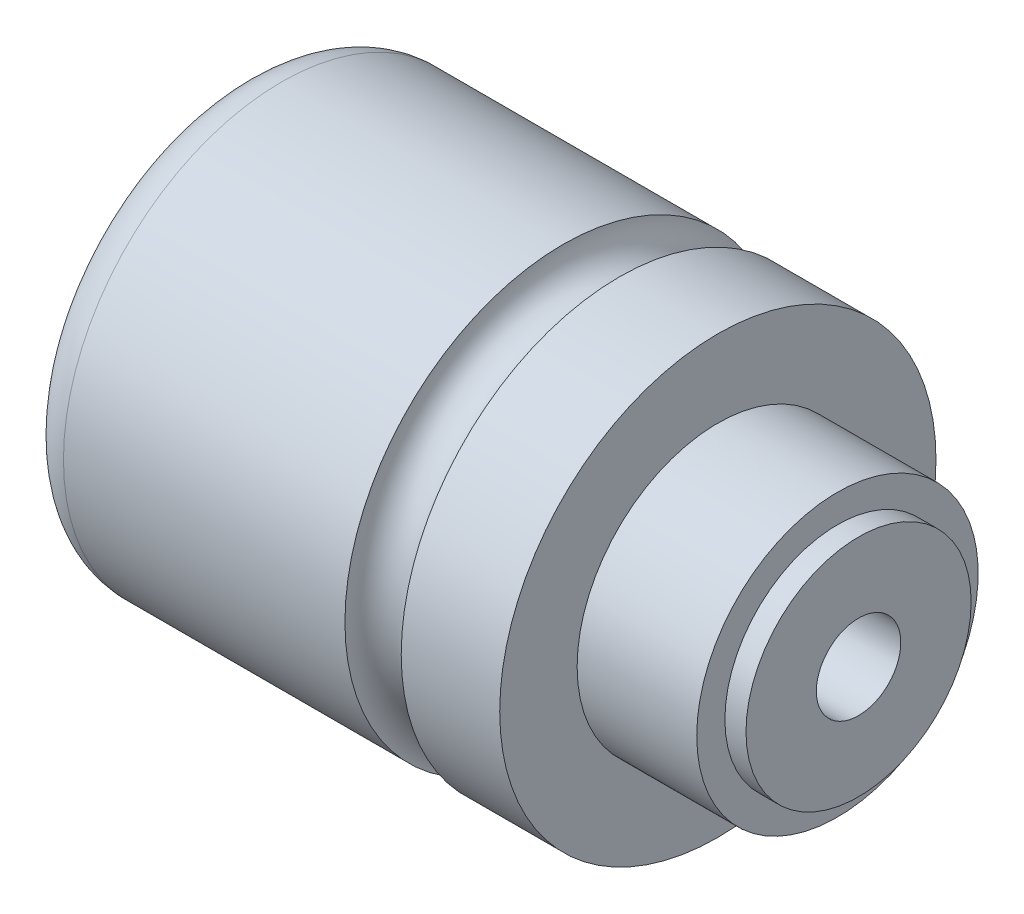
ISO-10303-21;
HEADER;
FILE_DESCRIPTION(('STEP AP214'),'2;1');
FILE_NAME('part.step','',(''),(''),'','','');
FILE_SCHEMA(('AUTOMOTIVE_DESIGN { 1 0 10303 214 1 1 1 1 }'));
ENDSEC;
DATA;
#1=APPLICATION_CONTEXT('core data for automotive mechanical design processes');
#2=APPLICATION_PROTOCOL_DEFINITION('international standard','automotive_design',2000,#1);
#3=PRODUCT_CONTEXT('',#1,'mechanical');
#4=PRODUCT('Part','Part','',(#3));
#5=PRODUCT_RELATED_PRODUCT_CATEGORY('part','',(#4));
#6=PRODUCT_DEFINITION_FORMATION('','',#4);
#7=PRODUCT_DEFINITION_CONTEXT('part definition',#1,'design');
#8=PRODUCT_DEFINITION('design','',#6,#7);
#9=PRODUCT_DEFINITION_SHAPE('','',#8);
#10=(LENGTH_UNIT() NAMED_UNIT(*) SI_UNIT(.MILLI.,.METRE.));
#11=(NAMED_UNIT(*) PLANE_ANGLE_UNIT() SI_UNIT($,.RADIAN.));
#12=(NAMED_UNIT(*) SI_UNIT($,.STERADIAN.) SOLID_ANGLE_UNIT());
#13=UNCERTAINTY_MEASURE_WITH_UNIT(LENGTH_MEASURE(1.E-05),#10,'distance_accuracy_value','');
#14=(GEOMETRIC_REPRESENTATION_CONTEXT(3) GLOBAL_UNCERTAINTY_ASSIGNED_CONTEXT((#13)) GLOBAL_UNIT_ASSIGNED_CONTEXT((#10,
#11,#12)) REPRESENTATION_CONTEXT('',''));
#15=CARTESIAN_POINT('',(0.,0.,0.));
#16=DIRECTION('',(0.,0.,1.));
#17=DIRECTION('',(1.,0.,0.));
#18=AXIS2_PLACEMENT_3D('',#15,#16,#17);
#19=CARTESIAN_POINT('',(-44.,0.,0.));
#20=DIRECTION('',(-1.,0.,0.));
#21=DIRECTION('',(0.,0.,1.));
#22=AXIS2_PLACEMENT_3D('',#19,#20,#21);
#23=CYLINDRICAL_SURFACE('',#22,31.);
#24=CARTESIAN_POINT('',(-38.,0.,0.));
#25=DIRECTION('',(1.,0.,0.));
#26=DIRECTION('',(0.,0.,-1.));
#27=AXIS2_PLACEMENT_3D('',#24,#25,#26);
#28=CIRCLE('',#27,31.);
#29=CARTESIAN_POINT('',(-38.,0.,-31.));
#30=VERTEX_POINT('',#29);
#31=EDGE_CURVE('E10',#30,#30,#28,.T.);
#32=ORIENTED_EDGE('',*,*,#31,.T.);
#33=EDGE_LOOP('',(#32));
#34=FACE_BOUND('',#33,.T.);
#35=CARTESIAN_POINT('',(2.,0.,0.));
#36=DIRECTION('',(-1.,0.,0.));
#37=DIRECTION('',(0.,0.,1.));
#38=AXIS2_PLACEMENT_3D('',#35,#36,#37);
#39=CIRCLE('',#38,31.);
#40=CARTESIAN_POINT('',(2.,0.,31.));
#41=VERTEX_POINT('',#40);
#42=EDGE_CURVE('E100',#41,#41,#39,.T.);
#43=ORIENTED_EDGE('',*,*,#42,.T.);
#44=EDGE_LOOP('',(#43));
#45=FACE_BOUND('',#44,.T.);
#46=ADVANCED_FACE('F35',(#34,#45),#23,.T.);
#47=CARTESIAN_POINT('',(-44.,0.,0.));
#48=DIRECTION('',(-1.,0.,0.));
#49=DIRECTION('',(0.,0.,1.));
#50=AXIS2_PLACEMENT_3D('',#47,#48,#49);
#51=CYLINDRICAL_SURFACE('',#50,25.);
#52=CARTESIAN_POINT('',(-42.5,0.,0.));
#53=DIRECTION('',(-1.,0.,0.));
#54=DIRECTION('',(0.,0.,1.));
#55=AXIS2_PLACEMENT_3D('',#52,#53,#54);
#56=CIRCLE('',#55,25.);
#57=CARTESIAN_POINT('',(-42.5,0.,25.));
#58=VERTEX_POINT('',#57);
#59=EDGE_CURVE('E46',#58,#58,#56,.T.);
#60=ORIENTED_EDGE('',*,*,#59,.F.);
#61=EDGE_LOOP('',(#60));
#62=FACE_BOUND('',#61,.T.);
#63=CARTESIAN_POINT('',(-44.,0.,0.));
#64=DIRECTION('',(-1.,0.,0.));
#65=DIRECTION('',(0.,0.,1.));
#66=AXIS2_PLACEMENT_3D('',#63,#64,#65);
#67=CIRCLE('',#66,25.);
#68=CARTESIAN_POINT('',(-44.,0.,25.));
#69=VERTEX_POINT('',#68);
#70=EDGE_CURVE('E42',#69,#69,#67,.T.);
#71=ORIENTED_EDGE('',*,*,#70,.T.);
#72=EDGE_LOOP('',(#71));
#73=FACE_BOUND('',#72,.T.);
#74=ADVANCED_FACE('F204',(#62,#73),#51,.F.);
#75=CARTESIAN_POINT('',(-42.5,25.,0.));
#76=DIRECTION('',(1.,0.,0.));
#77=DIRECTION('',(0.,0.,-1.));
#78=AXIS2_PLACEMENT_3D('',#75,#76,#77);
#79=PLANE('',#78);
#80=CARTESIAN_POINT('',(-42.5,0.,0.));
#81=DIRECTION('',(-1.,0.,0.));
#82=DIRECTION('',(0.,0.,1.));
#83=AXIS2_PLACEMENT_3D('',#80,#81,#82);
#84=CIRCLE('',#83,16.);
#85=CARTESIAN_POINT('',(-42.5,0.,16.));
#86=VERTEX_POINT('',#85);
#87=EDGE_CURVE('E50',#86,#86,#84,.T.);
#88=ORIENTED_EDGE('',*,*,#87,.F.);
#89=EDGE_LOOP('',(#88));
#90=FACE_BOUND('',#89,.T.);
#91=ORIENTED_EDGE('',*,*,#59,.T.);
#92=EDGE_LOOP('',(#91));
#93=FACE_BOUND('',#92,.T.);
#94=ADVANCED_FACE('F198',(#90,#93),#79,.F.);
#95=CARTESIAN_POINT('',(-44.,0.,0.));
#96=DIRECTION('',(-1.,0.,0.));
#97=DIRECTION('',(0.,0.,1.));
#98=AXIS2_PLACEMENT_3D('',#95,#96,#97);
#99=CYLINDRICAL_SURFACE('',#98,16.);
#100=CARTESIAN_POINT('',(-32.,0.,0.));
#101=DIRECTION('',(-1.,0.,0.));
#102=DIRECTION('',(0.,0.,1.));
#103=AXIS2_PLACEMENT_3D('',#100,#101,#102);
#104=CIRCLE('',#103,16.);
#105=CARTESIAN_POINT('',(-32.,0.,16.));
#106=VERTEX_POINT('',#105);
#107=EDGE_CURVE('E55',#106,#106,#104,.T.);
#108=ORIENTED_EDGE('',*,*,#107,.F.);
#109=EDGE_LOOP('',(#108));
#110=FACE_BOUND('',#109,.T.);
#111=ORIENTED_EDGE('',*,*,#87,.T.);
#112=EDGE_LOOP('',(#111));
#113=FACE_BOUND('',#112,.T.);
#114=ADVANCED_FACE('F192',(#110,#113),#99,.F.);
#115=CARTESIAN_POINT('',(-32.,16.,0.));
#116=DIRECTION('',(1.,0.,0.));
#117=DIRECTION('',(0.,0.,-1.));
#118=AXIS2_PLACEMENT_3D('',#115,#116,#117);
#119=PLANE('',#118);
#120=CARTESIAN_POINT('',(-32.,0.,0.));
#121=DIRECTION('',(-1.,0.,0.));
#122=DIRECTION('',(0.,0.,1.));
#123=AXIS2_PLACEMENT_3D('',#120,#121,#122);
#124=CIRCLE('',#123,12.5);
#125=CARTESIAN_POINT('',(-32.,0.,12.5));
#126=VERTEX_POINT('',#125);
#127=EDGE_CURVE('E58',#126,#126,#124,.T.);
#128=ORIENTED_EDGE('',*,*,#127,.F.);
#129=EDGE_LOOP('',(#128));
#130=FACE_BOUND('',#129,.T.);
#131=ORIENTED_EDGE('',*,*,#107,.T.);
#132=EDGE_LOOP('',(#131));
#133=FACE_BOUND('',#132,.T.);
#134=ADVANCED_FACE('F186',(#130,#133),#119,.F.);
#135=CARTESIAN_POINT('',(-44.,0.,0.));
#136=DIRECTION('',(-1.,0.,0.));
#137=DIRECTION('',(0.,0.,1.));
#138=AXIS2_PLACEMENT_3D('',#135,#136,#137);
#139=CYLINDRICAL_SURFACE('',#138,12.5);
#140=CARTESIAN_POINT('',(-29.,0.,0.));
#141=DIRECTION('',(-1.,0.,0.));
#142=DIRECTION('',(0.,0.,1.));
#143=AXIS2_PLACEMENT_3D('',#140,#141,#142);
#144=CIRCLE('',#143,12.5);
#145=CARTESIAN_POINT('',(-29.,0.,12.5));
#146=VERTEX_POINT('',#145);
#147=EDGE_CURVE('E61',#146,#146,#144,.T.);
#148=ORIENTED_EDGE('',*,*,#147,.F.);
#149=EDGE_LOOP('',(#148));
#150=FACE_BOUND('',#149,.T.);
#151=ORIENTED_EDGE('',*,*,#127,.T.);
#152=EDGE_LOOP('',(#151));
#153=FACE_BOUND('',#152,.T.);
#154=ADVANCED_FACE('F180',(#150,#153),#139,.F.);
#155=CARTESIAN_POINT('',(-29.,12.5,0.));
#156=DIRECTION('',(-1.,0.,0.));
#157=DIRECTION('',(0.,0.,1.));
#158=AXIS2_PLACEMENT_3D('',#155,#156,#157);
#159=PLANE('',#158);
#160=CARTESIAN_POINT('',(-29.,0.,0.));
#161=DIRECTION('',(-1.,0.,0.));
#162=DIRECTION('',(0.,0.,1.));
#163=AXIS2_PLACEMENT_3D('',#160,#161,#162);
#164=CIRCLE('',#163,20.5);
#165=CARTESIAN_POINT('',(-29.,0.,20.5));
#166=VERTEX_POINT('',#165);
#167=EDGE_CURVE('E64',#166,#166,#164,.T.);
#168=ORIENTED_EDGE('',*,*,#167,.F.);
#169=EDGE_LOOP('',(#168));
#170=FACE_BOUND('',#169,.T.);
#171=ORIENTED_EDGE('',*,*,#147,.T.);
#172=EDGE_LOOP('',(#171));
#173=FACE_BOUND('',#172,.T.);
#174=ADVANCED_FACE('F174',(#170,#173),#159,.F.);
#175=CARTESIAN_POINT('',(-44.,0.,0.));
#176=DIRECTION('',(-1.,0.,0.));
#177=DIRECTION('',(0.,0.,1.));
#178=AXIS2_PLACEMENT_3D('',#175,#176,#177);
#179=CYLINDRICAL_SURFACE('',#178,20.5);
#180=CARTESIAN_POINT('',(-22.,0.,0.));
#181=DIRECTION('',(-1.,0.,0.));
#182=DIRECTION('',(0.,0.,1.));
#183=AXIS2_PLACEMENT_3D('',#180,#181,#182);
#184=CIRCLE('',#183,20.5);
#185=CARTESIAN_POINT('',(-22.,0.,20.5));
#186=VERTEX_POINT('',#185);
#187=EDGE_CURVE('E67',#186,#186,#184,.T.);
#188=ORIENTED_EDGE('',*,*,#187,.F.);
#189=EDGE_LOOP('',(#188));
#190=FACE_BOUND('',#189,.T.);
#191=ORIENTED_EDGE('',*,*,#167,.T.);
#192=EDGE_LOOP('',(#191));
#193=FACE_BOUND('',#192,.T.);
#194=ADVANCED_FACE('F168',(#190,#193),#179,.F.);
#195=CARTESIAN_POINT('',(-22.,20.5,0.));
#196=DIRECTION('',(1.,0.,0.));
#197=DIRECTION('',(0.,0.,-1.));
#198=AXIS2_PLACEMENT_3D('',#195,#196,#197);
#199=PLANE('',#198);
#200=CARTESIAN_POINT('',(-22.,0.,0.));
#201=DIRECTION('',(-1.,0.,0.));
#202=DIRECTION('',(0.,0.,1.));
#203=AXIS2_PLACEMENT_3D('',#200,#201,#202);
#204=CIRCLE('',#203,16.);
#205=CARTESIAN_POINT('',(-22.,0.,16.));
#206=VERTEX_POINT('',#205);
#207=EDGE_CURVE('E70',#206,#206,#204,.T.);
#208=ORIENTED_EDGE('',*,*,#207,.F.);
#209=EDGE_LOOP('',(#208));
#210=FACE_BOUND('',#209,.T.);
#211=ORIENTED_EDGE('',*,*,#187,.T.);
#212=EDGE_LOOP('',(#211));
#213=FACE_BOUND('',#212,.T.);
#214=ADVANCED_FACE('F162',(#210,#213),#199,.F.);
#215=CARTESIAN_POINT('',(-44.,0.,0.));
#216=DIRECTION('',(-1.,0.,0.));
#217=DIRECTION('',(0.,0.,1.));
#218=AXIS2_PLACEMENT_3D('',#215,#216,#217);
#219=CYLINDRICAL_SURFACE('',#218,16.);
#220=CARTESIAN_POINT('',(-14.,0.,0.));
#221=DIRECTION('',(-1.,0.,0.));
#222=DIRECTION('',(0.,0.,1.));
#223=AXIS2_PLACEMENT_3D('',#220,#221,#222);
#224=CIRCLE('',#223,16.);
#225=CARTESIAN_POINT('',(-14.,0.,16.));
#226=VERTEX_POINT('',#225);
#227=EDGE_CURVE('E73',#226,#226,#224,.T.);
#228=ORIENTED_EDGE('',*,*,#227,.F.);
#229=EDGE_LOOP('',(#228));
#230=FACE_BOUND('',#229,.T.);
#231=ORIENTED_EDGE('',*,*,#207,.T.);
#232=EDGE_LOOP('',(#231));
#233=FACE_BOUND('',#232,.T.);
#234=ADVANCED_FACE('F156',(#230,#233),#219,.F.);
#235=CARTESIAN_POINT('',(-14.,16.,0.));
#236=DIRECTION('',(1.,0.,0.));
#237=DIRECTION('',(0.,0.,-1.));
#238=AXIS2_PLACEMENT_3D('',#235,#236,#237);
#239=PLANE('',#238);
#240=CARTESIAN_POINT('',(-14.,0.,0.));
#241=DIRECTION('',(-1.,0.,0.));
#242=DIRECTION('',(0.,0.,1.));
#243=AXIS2_PLACEMENT_3D('',#240,#241,#242);
#244=CIRCLE('',#243,6.);
#245=CARTESIAN_POINT('',(-14.,0.,6.));
#246=VERTEX_POINT('',#245);
#247=EDGE_CURVE('E76',#246,#246,#244,.T.);
#248=ORIENTED_EDGE('',*,*,#247,.F.);
#249=EDGE_LOOP('',(#248));
#250=FACE_BOUND('',#249,.T.);
#251=ORIENTED_EDGE('',*,*,#227,.T.);
#252=EDGE_LOOP('',(#251));
#253=FACE_BOUND('',#252,.T.);
#254=ADVANCED_FACE('F150',(#250,#253),#239,.F.);
#255=CARTESIAN_POINT('',(-44.,0.,0.));
#256=DIRECTION('',(-1.,0.,0.));
#257=DIRECTION('',(0.,0.,1.));
#258=AXIS2_PLACEMENT_3D('',#255,#256,#257);
#259=CYLINDRICAL_SURFACE('',#258,6.);
#260=CARTESIAN_POINT('',(44.,0.,0.));
#261=DIRECTION('',(-1.,0.,0.));
#262=DIRECTION('',(0.,0.,1.));
#263=AXIS2_PLACEMENT_3D('',#260,#261,#262);
#264=CIRCLE('',#263,6.);
#265=CARTESIAN_POINT('',(44.,0.,6.));
#266=VERTEX_POINT('',#265);
#267=EDGE_CURVE('E79',#266,#266,#264,.T.);
#268=ORIENTED_EDGE('',*,*,#267,.F.);
#269=EDGE_LOOP('',(#268));
#270=FACE_BOUND('',#269,.T.);
#271=ORIENTED_EDGE('',*,*,#247,.T.);
#272=EDGE_LOOP('',(#271));
#273=FACE_BOUND('',#272,.T.);
#274=ADVANCED_FACE('F144',(#270,#273),#259,.F.);
#275=CARTESIAN_POINT('',(44.,6.,0.));
#276=DIRECTION('',(-1.,0.,0.));
#277=DIRECTION('',(0.,0.,1.));
#278=AXIS2_PLACEMENT_3D('',#275,#276,#277);
#279=PLANE('',#278);
#280=CARTESIAN_POINT('',(44.,0.,0.));
#281=DIRECTION('',(-1.,0.,0.));
#282=DIRECTION('',(0.,0.,1.));
#283=AXIS2_PLACEMENT_3D('',#280,#281,#282);
#284=CIRCLE('',#283,16.);
#285=CARTESIAN_POINT('',(44.,0.,16.));
#286=VERTEX_POINT('',#285);
#287=EDGE_CURVE('E82',#286,#286,#284,.T.);
#288=ORIENTED_EDGE('',*,*,#287,.F.);
#289=EDGE_LOOP('',(#288));
#290=FACE_BOUND('',#289,.T.);
#291=ORIENTED_EDGE('',*,*,#267,.T.);
#292=EDGE_LOOP('',(#291));
#293=FACE_BOUND('',#292,.T.);
#294=ADVANCED_FACE('F138',(#290,#293),#279,.F.);
#295=CARTESIAN_POINT('',(-44.,0.,0.));
#296=DIRECTION('',(-1.,0.,0.));
#297=DIRECTION('',(0.,0.,1.));
#298=AXIS2_PLACEMENT_3D('',#295,#296,#297);
#299=CYLINDRICAL_SURFACE('',#298,16.);
#300=CARTESIAN_POINT('',(41.,0.,0.));
#301=DIRECTION('',(-1.,0.,0.));
#302=DIRECTION('',(0.,0.,1.));
#303=AXIS2_PLACEMENT_3D('',#300,#301,#302);
#304=CIRCLE('',#303,16.);
#305=CARTESIAN_POINT('',(41.,0.,16.));
#306=VERTEX_POINT('',#305);
#307=EDGE_CURVE('E85',#306,#306,#304,.T.);
#308=ORIENTED_EDGE('',*,*,#307,.F.);
#309=EDGE_LOOP('',(#308));
#310=FACE_BOUND('',#309,.T.);
#311=ORIENTED_EDGE('',*,*,#287,.T.);
#312=EDGE_LOOP('',(#311));
#313=FACE_BOUND('',#312,.T.);
#314=ADVANCED_FACE('F132',(#310,#313),#299,.T.);
#315=CARTESIAN_POINT('',(41.,16.,0.));
#316=DIRECTION('',(-1.,0.,0.));
#317=DIRECTION('',(0.,0.,1.));
#318=AXIS2_PLACEMENT_3D('',#315,#316,#317);
#319=PLANE('',#318);
#320=CARTESIAN_POINT('',(41.,0.,0.));
#321=DIRECTION('',(-1.,0.,0.));
#322=DIRECTION('',(0.,0.,1.));
#323=AXIS2_PLACEMENT_3D('',#320,#321,#322);
#324=CIRCLE('',#323,20.);
#325=CARTESIAN_POINT('',(41.,0.,20.));
#326=VERTEX_POINT('',#325);
#327=EDGE_CURVE('E88',#326,#326,#324,.T.);
#328=ORIENTED_EDGE('',*,*,#327,.F.);
#329=EDGE_LOOP('',(#328));
#330=FACE_BOUND('',#329,.T.);
#331=ORIENTED_EDGE('',*,*,#307,.T.);
#332=EDGE_LOOP('',(#331));
#333=FACE_BOUND('',#332,.T.);
#334=ADVANCED_FACE('F126',(#330,#333),#319,.F.);
#335=CARTESIAN_POINT('',(-44.,0.,0.));
#336=DIRECTION('',(-1.,0.,0.));
#337=DIRECTION('',(0.,0.,1.));
#338=AXIS2_PLACEMENT_3D('',#335,#336,#337);
#339=CYLINDRICAL_SURFACE('',#338,20.);
#340=CARTESIAN_POINT('',(24.,0.,0.));
#341=DIRECTION('',(-1.,0.,0.));
#342=DIRECTION('',(0.,0.,1.));
#343=AXIS2_PLACEMENT_3D('',#340,#341,#342);
#344=CIRCLE('',#343,20.);
#345=CARTESIAN_POINT('',(24.,0.,20.));
#346=VERTEX_POINT('',#345);
#347=EDGE_CURVE('E91',#346,#346,#344,.T.);
#348=ORIENTED_EDGE('',*,*,#347,.F.);
#349=EDGE_LOOP('',(#348));
#350=FACE_BOUND('',#349,.T.);
#351=ORIENTED_EDGE('',*,*,#327,.T.);
#352=EDGE_LOOP('',(#351));
#353=FACE_BOUND('',#352,.T.);
#354=ADVANCED_FACE('F120',(#350,#353),#339,.T.);
#355=CARTESIAN_POINT('',(24.,20.,0.));
#356=DIRECTION('',(-1.,0.,0.));
#357=DIRECTION('',(0.,0.,1.));
#358=AXIS2_PLACEMENT_3D('',#355,#356,#357);
#359=PLANE('',#358);
#360=CARTESIAN_POINT('',(24.,0.,0.));
#361=DIRECTION('',(-1.,0.,0.));
#362=DIRECTION('',(0.,0.,1.));
#363=AXIS2_PLACEMENT_3D('',#360,#361,#362);
#364=CIRCLE('',#363,31.);
#365=CARTESIAN_POINT('',(24.,0.,31.));
#366=VERTEX_POINT('',#365);
#367=EDGE_CURVE('E94',#366,#366,#364,.T.);
#368=ORIENTED_EDGE('',*,*,#367,.F.);
#369=EDGE_LOOP('',(#368));
#370=FACE_BOUND('',#369,.T.);
#371=ORIENTED_EDGE('',*,*,#347,.T.);
#372=EDGE_LOOP('',(#371));
#373=FACE_BOUND('',#372,.T.);
#374=ADVANCED_FACE('F114',(#370,#373),#359,.F.);
#375=CARTESIAN_POINT('',(-44.,0.,0.));
#376=DIRECTION('',(-1.,0.,0.));
#377=DIRECTION('',(0.,0.,1.));
#378=AXIS2_PLACEMENT_3D('',#375,#376,#377);
#379=CYLINDRICAL_SURFACE('',#378,31.);
#380=CARTESIAN_POINT('',(9.99999999999999,0.,0.));
#381=DIRECTION('',(-1.,0.,0.));
#382=DIRECTION('',(0.,0.,1.));
#383=AXIS2_PLACEMENT_3D('',#380,#381,#382);
#384=CIRCLE('',#383,31.);
#385=CARTESIAN_POINT('',(9.99999999999999,0.,31.));
#386=VERTEX_POINT('',#385);
#387=EDGE_CURVE('E97',#386,#386,#384,.T.);
#388=ORIENTED_EDGE('',*,*,#387,.F.);
#389=EDGE_LOOP('',(#388));
#390=FACE_BOUND('',#389,.T.);
#391=ORIENTED_EDGE('',*,*,#367,.T.);
#392=EDGE_LOOP('',(#391));
#393=FACE_BOUND('',#392,.T.);
#394=ADVANCED_FACE('F108',(#390,#393),#379,.T.);
#395=CARTESIAN_POINT('',(6.,0.,0.));
#396=DIRECTION('',(-1.,0.,0.));
#397=DIRECTION('',(0.,0.,1.));
#398=AXIS2_PLACEMENT_3D('',#395,#396,#397);
#399=TOROIDAL_SURFACE('',#398,31.,4.);
#400=ORIENTED_EDGE('',*,*,#42,.F.);
#401=EDGE_LOOP('',(#400));
#402=FACE_BOUND('',#401,.T.);
#403=ORIENTED_EDGE('',*,*,#387,.T.);
#404=EDGE_LOOP('',(#403));
#405=FACE_BOUND('',#404,.T.);
#406=ADVANCED_FACE('F105',(#402,#405),#399,.F.);
#407=CARTESIAN_POINT('',(-38.,0.,0.));
#408=DIRECTION('',(1.,0.,0.));
#409=DIRECTION('',(0.,0.,-1.));
#410=AXIS2_PLACEMENT_3D('',#407,#408,#409);
#411=TOROIDAL_SURFACE('',#410,25.,6.);
#412=ORIENTED_EDGE('',*,*,#31,.F.);
#413=EDGE_LOOP('',(#412));
#414=FACE_BOUND('',#413,.T.);
#415=ORIENTED_EDGE('',*,*,#70,.F.);
#416=EDGE_LOOP('',(#415));
#417=FACE_BOUND('',#416,.T.);
#418=ADVANCED_FACE('F37',(#414,#417),#411,.T.);
#419=CLOSED_SHELL('',(#46,#74,#94,#114,#134,#154,#174,#194,#214,#234,#254,#274,#294,#314,#334,
#354,#374,#394,#406,#418));
#420=MANIFOLD_SOLID_BREP('B2',#419);
#421=ADVANCED_BREP_SHAPE_REPRESENTATION('',(#18,#420),#14);
#422=SHAPE_DEFINITION_REPRESENTATION(#9,#421);
ENDSEC;
END-ISO-10303-21;
